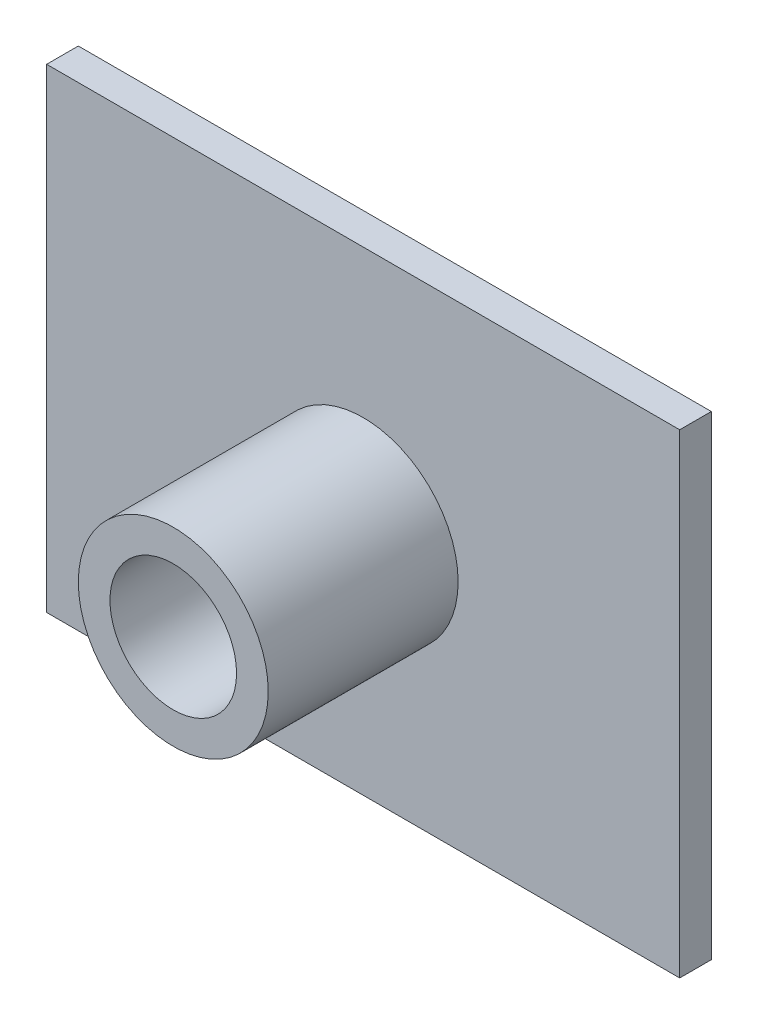
ISO-10303-21;
HEADER;
FILE_DESCRIPTION(('STEP AP214'),'2;1');
FILE_NAME('part.step','',(''),(''),'','','');
FILE_SCHEMA(('AUTOMOTIVE_DESIGN { 1 0 10303 214 1 1 1 1 }'));
ENDSEC;
DATA;
#1=APPLICATION_CONTEXT('core data for automotive mechanical design processes');
#2=APPLICATION_PROTOCOL_DEFINITION('international standard','automotive_design',2000,#1);
#3=PRODUCT_CONTEXT('',#1,'mechanical');
#4=PRODUCT('Part','Part','',(#3));
#5=PRODUCT_RELATED_PRODUCT_CATEGORY('part','',(#4));
#6=PRODUCT_DEFINITION_FORMATION('','',#4);
#7=PRODUCT_DEFINITION_CONTEXT('part definition',#1,'design');
#8=PRODUCT_DEFINITION('design','',#6,#7);
#9=PRODUCT_DEFINITION_SHAPE('','',#8);
#10=(LENGTH_UNIT() NAMED_UNIT(*) SI_UNIT(.MILLI.,.METRE.));
#11=(NAMED_UNIT(*) PLANE_ANGLE_UNIT() SI_UNIT($,.RADIAN.));
#12=(NAMED_UNIT(*) SI_UNIT($,.STERADIAN.) SOLID_ANGLE_UNIT());
#13=UNCERTAINTY_MEASURE_WITH_UNIT(LENGTH_MEASURE(1.E-05),#10,'distance_accuracy_value','');
#14=(GEOMETRIC_REPRESENTATION_CONTEXT(3) GLOBAL_UNCERTAINTY_ASSIGNED_CONTEXT((#13)) GLOBAL_UNIT_ASSIGNED_CONTEXT((#10,
#11,#12)) REPRESENTATION_CONTEXT('',''));
#15=CARTESIAN_POINT('',(0.,0.,0.));
#16=DIRECTION('',(0.,0.,1.));
#17=DIRECTION('',(1.,0.,0.));
#18=AXIS2_PLACEMENT_3D('',#15,#16,#17);
#19=CARTESIAN_POINT('',(0.,0.,1.27));
#20=DIRECTION('',(0.,1.,0.));
#21=DIRECTION('',(0.,0.,1.));
#22=AXIS2_PLACEMENT_3D('',#19,#20,#21);
#23=PLANE('',#22);
#24=DIRECTION('',(1.,0.,0.));
#25=VECTOR('',#24,1.);
#26=CARTESIAN_POINT('',(0.,0.,0.));
#27=LINE('',#26,#25);
#28=CARTESIAN_POINT('',(0.,0.,0.));
#29=VERTEX_POINT('',#28);
#30=CARTESIAN_POINT('',(25.4,0.,0.));
#31=VERTEX_POINT('',#30);
#32=EDGE_CURVE('E109',#29,#31,#27,.T.);
#33=ORIENTED_EDGE('',*,*,#32,.F.);
#34=DIRECTION('',(0.,0.,-1.));
#35=VECTOR('',#34,1.);
#36=CARTESIAN_POINT('',(0.,0.,1.27));
#37=LINE('',#36,#35);
#38=CARTESIAN_POINT('',(0.,0.,1.27));
#39=VERTEX_POINT('',#38);
#40=EDGE_CURVE('E51',#39,#29,#37,.T.);
#41=ORIENTED_EDGE('',*,*,#40,.F.);
#42=DIRECTION('',(1.,0.,0.));
#43=VECTOR('',#42,1.);
#44=CARTESIAN_POINT('',(0.,0.,1.27));
#45=LINE('',#44,#43);
#46=CARTESIAN_POINT('',(25.4,0.,1.27));
#47=VERTEX_POINT('',#46);
#48=EDGE_CURVE('E104',#39,#47,#45,.T.);
#49=ORIENTED_EDGE('',*,*,#48,.T.);
#50=DIRECTION('',(0.,0.,-1.));
#51=VECTOR('',#50,1.);
#52=CARTESIAN_POINT('',(25.4,0.,1.27));
#53=LINE('',#52,#51);
#54=EDGE_CURVE('E45',#47,#31,#53,.T.);
#55=ORIENTED_EDGE('',*,*,#54,.T.);
#56=EDGE_LOOP('',(#33,#41,#49,#55));
#57=FACE_BOUND('',#56,.T.);
#58=ADVANCED_FACE('F42',(#57),#23,.T.);
#59=CARTESIAN_POINT('',(0.,0.,1.27));
#60=DIRECTION('',(1.,0.,0.));
#61=DIRECTION('',(0.,1.,0.));
#62=AXIS2_PLACEMENT_3D('',#59,#60,#61);
#63=PLANE('',#62);
#64=DIRECTION('',(0.,-1.,0.));
#65=VECTOR('',#64,1.);
#66=CARTESIAN_POINT('',(0.,0.,0.));
#67=LINE('',#66,#65);
#68=CARTESIAN_POINT('',(0.,-19.05,0.));
#69=VERTEX_POINT('',#68);
#70=EDGE_CURVE('E76',#29,#69,#67,.T.);
#71=ORIENTED_EDGE('',*,*,#70,.T.);
#72=DIRECTION('',(0.,0.,-1.));
#73=VECTOR('',#72,1.);
#74=CARTESIAN_POINT('',(0.,-19.05,1.27));
#75=LINE('',#74,#73);
#76=CARTESIAN_POINT('',(0.,-19.05,1.27));
#77=VERTEX_POINT('',#76);
#78=EDGE_CURVE('E102',#77,#69,#75,.T.);
#79=ORIENTED_EDGE('',*,*,#78,.F.);
#80=DIRECTION('',(0.,-1.,0.));
#81=VECTOR('',#80,1.);
#82=CARTESIAN_POINT('',(0.,0.,1.27));
#83=LINE('',#82,#81);
#84=EDGE_CURVE('E91',#39,#77,#83,.T.);
#85=ORIENTED_EDGE('',*,*,#84,.F.);
#86=ORIENTED_EDGE('',*,*,#40,.T.);
#87=EDGE_LOOP('',(#71,#79,#85,#86));
#88=FACE_BOUND('',#87,.T.);
#89=ADVANCED_FACE('F121',(#88),#63,.F.);
#90=CARTESIAN_POINT('',(0.,-19.05,1.27));
#91=DIRECTION('',(0.,1.,0.));
#92=DIRECTION('',(0.,0.,1.));
#93=AXIS2_PLACEMENT_3D('',#90,#91,#92);
#94=PLANE('',#93);
#95=DIRECTION('',(1.,0.,0.));
#96=VECTOR('',#95,1.);
#97=CARTESIAN_POINT('',(0.,-19.05,0.));
#98=LINE('',#97,#96);
#99=CARTESIAN_POINT('',(25.4,-19.05,0.));
#100=VERTEX_POINT('',#99);
#101=EDGE_CURVE('E98',#69,#100,#98,.T.);
#102=ORIENTED_EDGE('',*,*,#101,.T.);
#103=DIRECTION('',(0.,0.,-1.));
#104=VECTOR('',#103,1.);
#105=CARTESIAN_POINT('',(25.4,-19.05,1.27));
#106=LINE('',#105,#104);
#107=CARTESIAN_POINT('',(25.4,-19.05,1.27));
#108=VERTEX_POINT('',#107);
#109=EDGE_CURVE('E95',#108,#100,#106,.T.);
#110=ORIENTED_EDGE('',*,*,#109,.F.);
#111=DIRECTION('',(1.,0.,0.));
#112=VECTOR('',#111,1.);
#113=CARTESIAN_POINT('',(0.,-19.05,1.27));
#114=LINE('',#113,#112);
#115=EDGE_CURVE('E88',#77,#108,#114,.T.);
#116=ORIENTED_EDGE('',*,*,#115,.F.);
#117=ORIENTED_EDGE('',*,*,#78,.T.);
#118=EDGE_LOOP('',(#102,#110,#116,#117));
#119=FACE_BOUND('',#118,.T.);
#120=ADVANCED_FACE('F96',(#119),#94,.F.);
#121=CARTESIAN_POINT('',(25.4,-19.05,1.27));
#122=DIRECTION('',(-1.,0.,0.));
#123=DIRECTION('',(0.,0.,1.));
#124=AXIS2_PLACEMENT_3D('',#121,#122,#123);
#125=PLANE('',#124);
#126=DIRECTION('',(0.,1.,0.));
#127=VECTOR('',#126,1.);
#128=CARTESIAN_POINT('',(25.4,-19.05,0.));
#129=LINE('',#128,#127);
#130=EDGE_CURVE('E112',#100,#31,#129,.T.);
#131=ORIENTED_EDGE('',*,*,#130,.T.);
#132=ORIENTED_EDGE('',*,*,#54,.F.);
#133=DIRECTION('',(0.,1.,0.));
#134=VECTOR('',#133,1.);
#135=CARTESIAN_POINT('',(25.4,-19.05,1.27));
#136=LINE('',#135,#134);
#137=EDGE_CURVE('E85',#108,#47,#136,.T.);
#138=ORIENTED_EDGE('',*,*,#137,.F.);
#139=ORIENTED_EDGE('',*,*,#109,.T.);
#140=EDGE_LOOP('',(#131,#132,#138,#139));
#141=FACE_BOUND('',#140,.T.);
#142=ADVANCED_FACE('F103',(#141),#125,.F.);
#143=CARTESIAN_POINT('',(0.,0.,1.27));
#144=DIRECTION('',(0.,0.,1.));
#145=DIRECTION('',(1.,0.,0.));
#146=AXIS2_PLACEMENT_3D('',#143,#144,#145);
#147=PLANE('',#146);
#148=CARTESIAN_POINT('',(12.7,-9.73339896317901,1.27));
#149=DIRECTION('',(0.,0.,1.));
#150=DIRECTION('',(1.,0.,0.));
#151=AXIS2_PLACEMENT_3D('',#148,#149,#150);
#152=CIRCLE('',#151,3.81);
#153=CARTESIAN_POINT('',(8.89,-9.73339896317901,1.27));
#154=VERTEX_POINT('',#153);
#155=EDGE_CURVE('E11',#154,#154,#152,.T.);
#156=ORIENTED_EDGE('',*,*,#155,.F.);
#157=EDGE_LOOP('',(#156));
#158=FACE_BOUND('',#157,.T.);
#159=ORIENTED_EDGE('',*,*,#48,.F.);
#160=ORIENTED_EDGE('',*,*,#84,.T.);
#161=ORIENTED_EDGE('',*,*,#115,.T.);
#162=ORIENTED_EDGE('',*,*,#137,.T.);
#163=EDGE_LOOP('',(#159,#160,#161,#162));
#164=FACE_BOUND('',#163,.T.);
#165=ADVANCED_FACE('F90',(#158,#164),#147,.T.);
#166=CARTESIAN_POINT('',(0.,0.,0.));
#167=DIRECTION('',(0.,0.,1.));
#168=DIRECTION('',(1.,0.,0.));
#169=AXIS2_PLACEMENT_3D('',#166,#167,#168);
#170=PLANE('',#169);
#171=ORIENTED_EDGE('',*,*,#32,.T.);
#172=ORIENTED_EDGE('',*,*,#130,.F.);
#173=ORIENTED_EDGE('',*,*,#101,.F.);
#174=ORIENTED_EDGE('',*,*,#70,.F.);
#175=EDGE_LOOP('',(#171,#172,#173,#174));
#176=FACE_BOUND('',#175,.T.);
#177=ADVANCED_FACE('F119',(#176),#170,.F.);
#178=CARTESIAN_POINT('',(12.7,-9.73339896317901,8.89));
#179=DIRECTION('',(0.,0.,-1.));
#180=DIRECTION('',(-1.,0.,0.));
#181=AXIS2_PLACEMENT_3D('',#178,#179,#180);
#182=CYLINDRICAL_SURFACE('',#181,3.81);
#183=CARTESIAN_POINT('',(12.7,-9.73339896317901,8.89));
#184=DIRECTION('',(0.,0.,1.));
#185=DIRECTION('',(1.,0.,0.));
#186=AXIS2_PLACEMENT_3D('',#183,#184,#185);
#187=CIRCLE('',#186,3.81);
#188=CARTESIAN_POINT('',(8.89,-9.73339896317901,8.89));
#189=VERTEX_POINT('',#188);
#190=EDGE_CURVE('E113',#189,#189,#187,.T.);
#191=CARTESIAN_POINT('',(8.89,-9.73339896317901,8.89));
#192=CARTESIAN_POINT('',(8.89,-9.73339896317901,8.810625));
#193=CARTESIAN_POINT('',(8.89,-9.73339896317901,8.73125));
#194=CARTESIAN_POINT('',(8.89,-9.73339896317901,8.5725));
#195=CARTESIAN_POINT('',(8.89,-9.73339896317901,8.493125));
#196=CARTESIAN_POINT('',(8.89,-9.73339896317901,8.334375));
#197=CARTESIAN_POINT('',(8.89,-9.73339896317901,8.255));
#198=CARTESIAN_POINT('',(8.89,-9.73339896317901,8.09625));
#199=CARTESIAN_POINT('',(8.89,-9.73339896317901,8.016875));
#200=CARTESIAN_POINT('',(8.89,-9.73339896317901,7.858125));
#201=CARTESIAN_POINT('',(8.89,-9.73339896317901,7.77875));
#202=CARTESIAN_POINT('',(8.89,-9.73339896317901,7.62));
#203=CARTESIAN_POINT('',(8.89,-9.73339896317901,7.540625));
#204=CARTESIAN_POINT('',(8.89,-9.73339896317901,7.381875));
#205=CARTESIAN_POINT('',(8.89,-9.73339896317901,7.3025));
#206=CARTESIAN_POINT('',(8.89,-9.73339896317901,7.14375));
#207=CARTESIAN_POINT('',(8.89,-9.73339896317901,7.064375));
#208=CARTESIAN_POINT('',(8.89,-9.73339896317901,6.905625));
#209=CARTESIAN_POINT('',(8.89,-9.73339896317901,6.82625));
#210=CARTESIAN_POINT('',(8.89,-9.73339896317901,6.6675));
#211=CARTESIAN_POINT('',(8.89,-9.73339896317901,6.588125));
#212=CARTESIAN_POINT('',(8.89,-9.73339896317901,6.429375));
#213=CARTESIAN_POINT('',(8.89,-9.73339896317901,6.35));
#214=CARTESIAN_POINT('',(8.89,-9.73339896317901,6.19125));
#215=CARTESIAN_POINT('',(8.89,-9.73339896317901,6.111875));
#216=CARTESIAN_POINT('',(8.89,-9.73339896317901,5.953125));
#217=CARTESIAN_POINT('',(8.89,-9.73339896317901,5.87375));
#218=CARTESIAN_POINT('',(8.89,-9.73339896317901,5.715));
#219=CARTESIAN_POINT('',(8.89,-9.73339896317901,5.635625));
#220=CARTESIAN_POINT('',(8.89,-9.73339896317901,5.476875));
#221=CARTESIAN_POINT('',(8.89,-9.73339896317901,5.3975));
#222=CARTESIAN_POINT('',(8.89,-9.73339896317901,5.23875));
#223=CARTESIAN_POINT('',(8.89,-9.73339896317901,5.159375));
#224=CARTESIAN_POINT('',(8.89,-9.73339896317901,5.000625));
#225=CARTESIAN_POINT('',(8.89,-9.73339896317901,4.92125));
#226=CARTESIAN_POINT('',(8.89,-9.73339896317901,4.7625));
#227=CARTESIAN_POINT('',(8.89,-9.73339896317901,4.683125));
#228=CARTESIAN_POINT('',(8.89,-9.73339896317901,4.524375));
#229=CARTESIAN_POINT('',(8.89,-9.73339896317901,4.445));
#230=CARTESIAN_POINT('',(8.89,-9.73339896317901,4.28625));
#231=CARTESIAN_POINT('',(8.89,-9.73339896317901,4.206875));
#232=CARTESIAN_POINT('',(8.89,-9.73339896317901,4.048125));
#233=CARTESIAN_POINT('',(8.89,-9.73339896317901,3.96875));
#234=CARTESIAN_POINT('',(8.89,-9.73339896317901,3.81));
#235=CARTESIAN_POINT('',(8.89,-9.73339896317901,3.730625));
#236=CARTESIAN_POINT('',(8.89,-9.73339896317901,3.571875));
#237=CARTESIAN_POINT('',(8.89,-9.73339896317901,3.4925));
#238=CARTESIAN_POINT('',(8.89,-9.73339896317901,3.33375));
#239=CARTESIAN_POINT('',(8.89,-9.73339896317901,3.254375));
#240=CARTESIAN_POINT('',(8.89,-9.73339896317901,3.095625));
#241=CARTESIAN_POINT('',(8.89,-9.73339896317901,3.01625));
#242=CARTESIAN_POINT('',(8.89,-9.73339896317901,2.8575));
#243=CARTESIAN_POINT('',(8.89,-9.73339896317901,2.778125));
#244=CARTESIAN_POINT('',(8.89,-9.73339896317901,2.619375));
#245=CARTESIAN_POINT('',(8.89,-9.73339896317901,2.54));
#246=CARTESIAN_POINT('',(8.89,-9.73339896317901,2.38125));
#247=CARTESIAN_POINT('',(8.89,-9.73339896317901,2.301875));
#248=CARTESIAN_POINT('',(8.89,-9.73339896317901,2.143125));
#249=CARTESIAN_POINT('',(8.89,-9.73339896317901,2.06375));
#250=CARTESIAN_POINT('',(8.89,-9.73339896317901,1.905));
#251=CARTESIAN_POINT('',(8.89,-9.73339896317901,1.825625));
#252=CARTESIAN_POINT('',(8.89,-9.73339896317901,1.666875));
#253=CARTESIAN_POINT('',(8.89,-9.73339896317901,1.5875));
#254=CARTESIAN_POINT('',(8.89,-9.73339896317901,1.42875));
#255=CARTESIAN_POINT('',(8.89,-9.73339896317901,1.349375));
#256=CARTESIAN_POINT('',(8.89,-9.73339896317901,1.27));
#257=B_SPLINE_CURVE_WITH_KNOTS('',3,(#191,#192,#193,#194,#195,#196,#197,#198,#199,#200,#201,
#202,#203,#204,#205,#206,#207,#208,#209,#210,#211,#212,#213,#214,#215,#216,#217,#218,#219,#220,
#221,#222,#223,#224,#225,#226,#227,#228,#229,#230,#231,#232,#233,#234,#235,#236,#237,#238,#239,
#240,#241,#242,#243,#244,#245,#246,#247,#248,#249,#250,#251,#252,#253,#254,#255,#256),
.UNSPECIFIED.,.F.,.F.,(4,2,2,2,2,2,2,2,2,2,2,2,2,2,2,2,2,2,2,2,2,2,2,2,2,2,2,2,2,2,2,2,4),(0.,
0.238124999999999,0.476249999999999,0.714375,0.952499999999998,1.190625,1.42875,1.666875,1.905,
2.143125,2.38125,2.619375,2.8575,3.095625,3.33375,3.571875,3.81,4.048125,4.28625,4.524375,
4.7625,5.000625,5.23875,5.476875,5.715,5.953125,6.19125,6.429375,6.6675,6.905625,7.14375,
7.381875,7.62),.UNSPECIFIED.);
#258=EDGE_CURVE('BSEAM141',#189,#154,#257,.T.);
#259=ORIENTED_EDGE('',*,*,#190,.F.);
#260=ORIENTED_EDGE('',*,*,#155,.T.);
#261=ORIENTED_EDGE('',*,*,#258,.T.);
#262=ORIENTED_EDGE('',*,*,#258,.F.);
#263=EDGE_LOOP('',(#259,#261,#260,#262));
#264=FACE_BOUND('',#263,.T.);
#265=ADVANCED_FACE('F141',(#264),#182,.T.);
#266=CARTESIAN_POINT('',(12.7,-9.73339896317901,8.89));
#267=DIRECTION('',(0.,0.,1.));
#268=DIRECTION('',(1.,0.,0.));
#269=AXIS2_PLACEMENT_3D('',#266,#267,#268);
#270=PLANE('',#269);
#271=CARTESIAN_POINT('',(12.7,-9.73339896317901,8.89));
#272=DIRECTION('',(0.,0.,1.));
#273=DIRECTION('',(1.,0.,0.));
#274=AXIS2_PLACEMENT_3D('',#271,#272,#273);
#275=CIRCLE('',#274,2.54);
#276=CARTESIAN_POINT('',(15.24,-9.73339896317901,8.89));
#277=VERTEX_POINT('',#276);
#278=EDGE_CURVE('E162',#277,#277,#275,.T.);
#279=ORIENTED_EDGE('',*,*,#278,.F.);
#280=EDGE_LOOP('',(#279));
#281=FACE_BOUND('',#280,.T.);
#282=ORIENTED_EDGE('',*,*,#190,.T.);
#283=EDGE_LOOP('',(#282));
#284=FACE_BOUND('',#283,.T.);
#285=ADVANCED_FACE('F145',(#281,#284),#270,.T.);
#286=CARTESIAN_POINT('',(12.7,-9.73339896317901,1.524));
#287=DIRECTION('',(0.,0.,1.));
#288=DIRECTION('',(1.,0.,0.));
#289=AXIS2_PLACEMENT_3D('',#286,#287,#288);
#290=CYLINDRICAL_SURFACE('',#289,2.54);
#291=CARTESIAN_POINT('',(12.7,-9.73339896317901,1.524));
#292=DIRECTION('',(0.,0.,1.));
#293=DIRECTION('',(1.,0.,0.));
#294=AXIS2_PLACEMENT_3D('',#291,#292,#293);
#295=CIRCLE('',#294,2.54);
#296=CARTESIAN_POINT('',(15.24,-9.73339896317901,1.524));
#297=VERTEX_POINT('',#296);
#298=EDGE_CURVE('E161',#297,#297,#295,.T.);
#299=ORIENTED_EDGE('',*,*,#298,.F.);
#300=EDGE_LOOP('',(#299));
#301=FACE_BOUND('',#300,.T.);
#302=ORIENTED_EDGE('',*,*,#278,.T.);
#303=EDGE_LOOP('',(#302));
#304=FACE_BOUND('',#303,.T.);
#305=ADVANCED_FACE('F149',(#301,#304),#290,.F.);
#306=CARTESIAN_POINT('',(12.7,-9.73339896317901,1.524));
#307=DIRECTION('',(0.,0.,1.));
#308=DIRECTION('',(1.,0.,0.));
#309=AXIS2_PLACEMENT_3D('',#306,#307,#308);
#310=PLANE('',#309);
#311=ORIENTED_EDGE('',*,*,#298,.T.);
#312=EDGE_LOOP('',(#311));
#313=FACE_BOUND('',#312,.T.);
#314=ADVANCED_FACE('F153',(#313),#310,.T.);
#315=CLOSED_SHELL('',(#58,#89,#120,#142,#165,#177,#265,#285,#305,#314));
#316=MANIFOLD_SOLID_BREP('B2',#315);
#317=ADVANCED_BREP_SHAPE_REPRESENTATION('',(#18,#316),#14);
#318=SHAPE_DEFINITION_REPRESENTATION(#9,#317);
ENDSEC;
END-ISO-10303-21;
